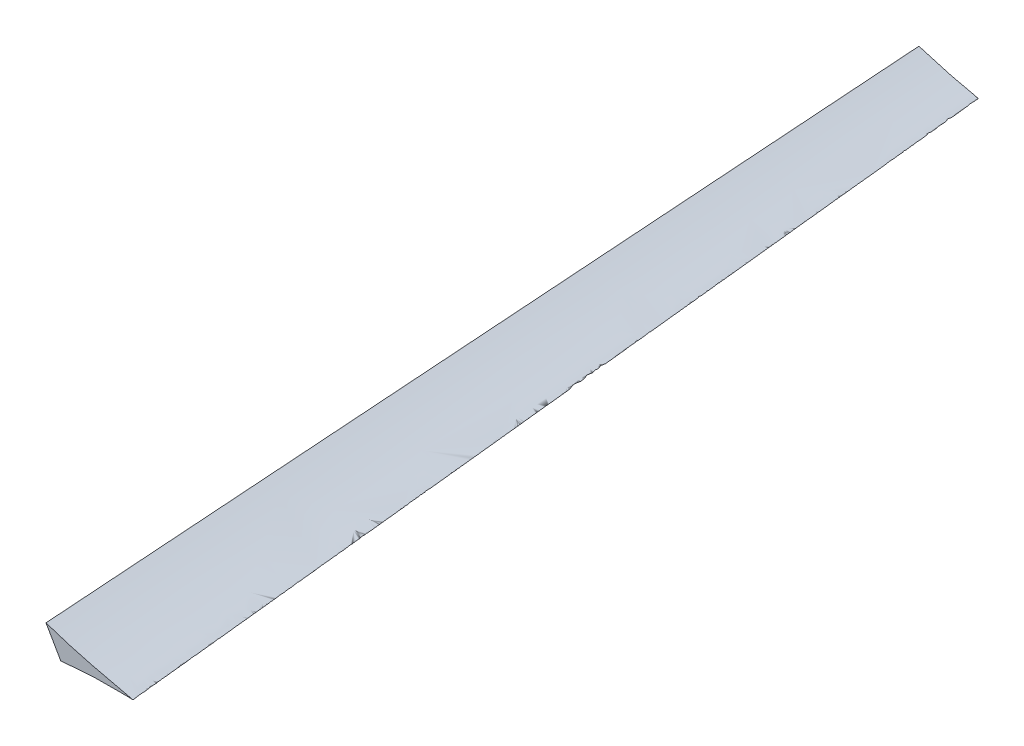
ISO-10303-21;
HEADER;
FILE_DESCRIPTION(('STEP AP214'),'2;1');
FILE_NAME('part.step','',(''),(''),'','','');
FILE_SCHEMA(('AUTOMOTIVE_DESIGN { 1 0 10303 214 1 1 1 1 }'));
ENDSEC;
DATA;
#1=APPLICATION_CONTEXT('core data for automotive mechanical design processes');
#2=APPLICATION_PROTOCOL_DEFINITION('international standard','automotive_design',2000,#1);
#3=PRODUCT_CONTEXT('',#1,'mechanical');
#4=PRODUCT('Part','Part','',(#3));
#5=PRODUCT_RELATED_PRODUCT_CATEGORY('part','',(#4));
#6=PRODUCT_DEFINITION_FORMATION('','',#4);
#7=PRODUCT_DEFINITION_CONTEXT('part definition',#1,'design');
#8=PRODUCT_DEFINITION('design','',#6,#7);
#9=PRODUCT_DEFINITION_SHAPE('','',#8);
#10=(LENGTH_UNIT() NAMED_UNIT(*) SI_UNIT(.MILLI.,.METRE.));
#11=(NAMED_UNIT(*) PLANE_ANGLE_UNIT() SI_UNIT($,.RADIAN.));
#12=(NAMED_UNIT(*) SI_UNIT($,.STERADIAN.) SOLID_ANGLE_UNIT());
#13=UNCERTAINTY_MEASURE_WITH_UNIT(LENGTH_MEASURE(1.E-05),#10,'distance_accuracy_value','');
#14=(GEOMETRIC_REPRESENTATION_CONTEXT(3) GLOBAL_UNCERTAINTY_ASSIGNED_CONTEXT((#13)) GLOBAL_UNIT_ASSIGNED_CONTEXT((#10,
#11,#12)) REPRESENTATION_CONTEXT('',''));
#15=CARTESIAN_POINT('',(0.,0.,0.));
#16=DIRECTION('',(0.,0.,1.));
#17=DIRECTION('',(1.,0.,0.));
#18=AXIS2_PLACEMENT_3D('',#15,#16,#17);
#19=CARTESIAN_POINT('',(-17.154805273375,-0.0944313994261866,-225.));
#20=DIRECTION('',(0.,0.,1.));
#21=DIRECTION('',(1.,0.,0.));
#22=AXIS2_PLACEMENT_3D('',#19,#20,#21);
#23=PLANE('',#22);
#24=CARTESIAN_POINT('',(-17.154805273375,4.28745633119217,-225.));
#25=CARTESIAN_POINT('',(-16.8274548071554,4.17854147808694,-225.));
#26=CARTESIAN_POINT('',(-16.4997626321679,4.07062789318908,-225.));
#27=CARTESIAN_POINT('',(-15.8434358874472,3.85764369440739,-225.));
#28=CARTESIAN_POINT('',(-15.5148012638481,3.75257324675626,-225.));
#29=CARTESIAN_POINT('',(-14.8564420552133,3.54615163630819,-225.));
#30=CARTESIAN_POINT('',(-14.5267177290354,3.44479965095852,-225.));
#31=CARTESIAN_POINT('',(-13.8659769446245,3.24642624477661,-225.));
#32=CARTESIAN_POINT('',(-13.5349605213983,3.14940470749282,-225.));
#33=CARTESIAN_POINT('',(-12.871648366401,2.95979194422061,-225.));
#34=CARTESIAN_POINT('',(-12.5393525844828,2.86720089384449,-225.));
#35=CARTESIAN_POINT('',(-11.8737026407721,2.68589221610204,-225.));
#36=CARTESIAN_POINT('',(-11.5403484606984,2.59717465603596,-225.));
#37=CARTESIAN_POINT('',(-10.8733992873974,2.42315086030521,-225.));
#38=CARTESIAN_POINT('',(-10.5398058295845,2.33783872492775,-225.));
#39=CARTESIAN_POINT('',(-9.87195586824538,2.16984964748907,-225.));
#40=CARTESIAN_POINT('',(-9.5376993617337,2.08717271732202,-225.));
#41=CARTESIAN_POINT('',(-8.86860293943321,1.92411829040433,-225.));
#42=CARTESIAN_POINT('',(-8.53376298634483,1.84374094685032,-225.));
#43=CARTESIAN_POINT('',(-8.03115106263001,1.72466007935425,-225.));
#44=CARTESIAN_POINT('',(-7.86355452081525,1.68521385040919,-225.));
#45=CARTESIAN_POINT('',(-7.528256526935,1.60676901085407,-225.));
#46=CARTESIAN_POINT('',(-7.36055507475706,1.5677704007246,-225.));
#47=CARTESIAN_POINT('',(-6.85730799932833,1.45156090581884,-225.));
#48=CARTESIAN_POINT('',(-6.52158219389306,1.37512746124546,-225.));
#49=CARTESIAN_POINT('',(-5.84951843928514,1.22501059156832,-225.));
#50=CARTESIAN_POINT('',(-5.51318049849585,1.15132712909568,-225.));
#51=CARTESIAN_POINT('',(-5.09242218145952,1.06133418195876,-225.));
#52=CARTESIAN_POINT('',(-5.00833595324779,1.04345846511528,-225.));
#53=CARTESIAN_POINT('',(-4.84011044559452,1.00795412760472,-225.));
#54=CARTESIAN_POINT('',(-4.75597116558276,0.990325509642616,-225.));
#55=CARTESIAN_POINT('',(-4.5877222370947,0.954907069724615,-225.));
#56=CARTESIAN_POINT('',(-4.50361259024129,0.937117240043163,-225.));
#57=CARTESIAN_POINT('',(-4.33550758699807,0.900956519205866,-225.));
#58=CARTESIAN_POINT('',(-4.25151224353177,0.88258556725356,-225.));
#59=CARTESIAN_POINT('',(-4.12569105641716,0.85426600896279,-225.));
#60=CARTESIAN_POINT('',(-4.08377945012904,0.844699003817763,-225.));
#61=CARTESIAN_POINT('',(-4.00002919467814,0.825257465364652,-225.));
#62=CARTESIAN_POINT('',(-3.95819054264244,0.815382944469138,-225.));
#63=CARTESIAN_POINT('',(-3.8954976790584,0.800299184135867,-225.));
#64=CARTESIAN_POINT('',(-3.87461072982664,0.795225889118224,-225.));
#65=CARTESIAN_POINT('',(-3.83286163533213,0.784983248998352,-225.));
#66=CARTESIAN_POINT('',(-3.81199948878006,0.779813909143917,-225.));
#67=CARTESIAN_POINT('',(-3.77029924049941,0.769367507842308,-225.));
#68=CARTESIAN_POINT('',(-3.74946114201505,0.764090433329137,-225.));
#69=CARTESIAN_POINT('',(-3.71822232217584,0.756100728274246,-225.));
#70=CARTESIAN_POINT('',(-3.70781182720145,0.753424985363909,-225.));
#71=CARTESIAN_POINT('',(-3.69220326178876,0.749377434636415,-225.));
#72=CARTESIAN_POINT('',(-3.68700127796001,0.748022509265523,-225.));
#73=CARTESIAN_POINT('',(-3.67659361044524,0.745328448450153,-225.));
#74=CARTESIAN_POINT('',(-3.6713879261694,0.743989316893704,-225.));
#75=CARTESIAN_POINT('',(-3.66521703496024,0.742341741978126,-225.));
#76=CARTESIAN_POINT('',(-3.66424292685211,0.742079879254616,-225.));
#77=CARTESIAN_POINT('',(-3.662275026068,0.74164294028181,-225.));
#78=CARTESIAN_POINT('',(-3.66128123515447,0.741467856298334,-225.));
#79=CARTESIAN_POINT('',(-3.65832373585228,0.74083740607208,-225.));
#80=CARTESIAN_POINT('',(-3.65638414082273,0.740276858035401,-225.));
#81=CARTESIAN_POINT('',(-3.65249412694922,0.73919834348764,-225.));
#82=CARTESIAN_POINT('',(-3.65054369877089,0.738680423007206,-225.));
#83=CARTESIAN_POINT('',(-3.64664508413168,0.737634000052685,-225.));
#84=CARTESIAN_POINT('',(-3.64469689750923,0.737105498399339,-225.));
#85=CARTESIAN_POINT('',(-3.6408004651271,0.736052349809624,-225.));
#86=CARTESIAN_POINT('',(-3.63885221966182,0.735527701506017,-225.));
#87=CARTESIAN_POINT('',(-3.6291257739167,0.732909551205167,-225.));
#88=CARTESIAN_POINT('',(-3.62134658390388,0.730819106000101,-225.));
#89=CARTESIAN_POINT('',(-3.60578374931704,0.726651030484295,-225.));
#90=CARTESIAN_POINT('',(-3.59800010428677,0.724573401922761,-225.));
#91=CARTESIAN_POINT('',(-3.57463265566895,0.71835459685448,-225.));
#92=CARTESIAN_POINT('',(-3.55904422767646,0.714230702692982,-225.));
#93=CARTESIAN_POINT('',(-3.51212162435898,0.701893434567638,-225.));
#94=CARTESIAN_POINT('',(-3.4807685792839,0.693751777687196,-225.));
#95=CARTESIAN_POINT('',(-3.41801270675659,0.677658599796763,-225.));
#96=CARTESIAN_POINT('',(-3.38660987780501,0.669707084633915,-225.));
#97=CARTESIAN_POINT('',(-3.32405533048103,0.654070246776564,-225.));
#98=CARTESIAN_POINT('',(-3.29290406501979,0.646383111429503,-225.));
#99=CARTESIAN_POINT('',(-3.23055752445763,0.631198114504568,-225.));
#100=CARTESIAN_POINT('',(-3.19936225239671,0.623700240469378,-225.));
#101=CARTESIAN_POINT('',(-3.16042484995815,0.614466820167867,-225.));
#102=CARTESIAN_POINT('',(-3.15270373313589,0.612642011848289,-225.));
#103=CARTESIAN_POINT('',(-3.13725750879781,0.60900373533487,-225.));
#104=CARTESIAN_POINT('',(-3.12953240085988,0.607190268863578,-225.));
#105=CARTESIAN_POINT('',(-3.11383593754039,0.603518076207635,-225.));
#106=CARTESIAN_POINT('',(-3.10586450712086,0.601659728491834,-225.));
#107=CARTESIAN_POINT('',(-3.08992065228005,0.597955753518258,-225.));
#108=CARTESIAN_POINT('',(-3.08194822975858,0.596110121136467,-225.));
#109=CARTESIAN_POINT('',(-3.06571389109438,0.592690870334895,-225.));
#110=CARTESIAN_POINT('',(-3.05745009387471,0.591126253510012,-225.));
#111=CARTESIAN_POINT('',(-3.0416211603906,0.58807777703294,-225.));
#112=CARTESIAN_POINT('',(-3.03405521991027,0.58659806098058,-225.));
#113=CARTESIAN_POINT('',(-3.02303042831954,0.584184046578115,-225.));
#114=CARTESIAN_POINT('',(-3.01954353537102,0.583382441190469,-225.));
#115=CARTESIAN_POINT('',(-3.0138728230176,0.581906147210064,-225.));
#116=CARTESIAN_POINT('',(-3.01167476480429,0.581290759728356,-225.));
#117=CARTESIAN_POINT('',(-3.00739326457115,0.579891400688159,-225.));
#118=CARTESIAN_POINT('',(-3.00530833122571,0.57911201630401,-225.));
#119=CARTESIAN_POINT('',(-3.00264169503864,0.57813583435996,-225.));
#120=CARTESIAN_POINT('',(-3.00206258646001,0.57792508020859,-225.));
#121=CARTESIAN_POINT('',(-3.00085965518158,0.577495254586398,-225.));
#122=CARTESIAN_POINT('',(-3.00023552631612,0.577276625533178,-225.));
#123=CARTESIAN_POINT('',(-2.99924573830641,0.576903545803618,-225.));
#124=CARTESIAN_POINT('',(-2.99887438763184,0.576757403600603,-225.));
#125=CARTESIAN_POINT('',(-2.99815948532802,0.576535510814193,-225.));
#126=CARTESIAN_POINT('',(-2.99782088588396,0.576452266799379,-225.));
#127=CARTESIAN_POINT('',(-2.99743622946959,0.576084050380272,-225.));
#128=CARTESIAN_POINT('',(-2.99732797917669,0.575916829912674,-225.));
#129=CARTESIAN_POINT('',(-2.99731846443573,0.57558232575548,-225.));
#130=CARTESIAN_POINT('',(-2.99741449170408,0.575415071925838,-225.));
#131=CARTESIAN_POINT('',(-2.99763058990272,0.575143900335442,-225.));
#132=CARTESIAN_POINT('',(-2.99774911299452,0.575037090540102,-225.));
#133=CARTESIAN_POINT('',(-2.9980124951954,0.574830932658372,-225.));
#134=CARTESIAN_POINT('',(-2.99815867932525,0.57473279201695,-225.));
#135=CARTESIAN_POINT('',(-2.99875677864996,0.574368407378923,-225.));
#136=CARTESIAN_POINT('',(-2.99923755098527,0.574156803281807,-225.));
#137=CARTESIAN_POINT('',(-3.00023699954129,0.573780242323621,-225.));
#138=CARTESIAN_POINT('',(-3.00075642275291,0.573617480637234,-225.));
#139=CARTESIAN_POINT('',(-3.00232321203038,0.573196546045231,-225.));
#140=CARTESIAN_POINT('',(-3.00338804266858,0.573001672155113,-225.));
#141=CARTESIAN_POINT('',(-3.00550123674396,0.572762959594012,-225.));
#142=CARTESIAN_POINT('',(-3.00654917083802,0.572714869931864,-225.));
#143=CARTESIAN_POINT('',(-3.00885539207372,0.572731437702774,-225.));
#144=CARTESIAN_POINT('',(-3.01011300946954,0.572821079123794,-225.));
#145=CARTESIAN_POINT('',(-3.01262981571037,0.572965280923609,-225.));
#146=CARTESIAN_POINT('',(-3.01388900504615,0.573019819708709,-225.));
#147=CARTESIAN_POINT('',(-3.01766602891057,0.573194045402714,-225.));
#148=CARTESIAN_POINT('',(-3.02018359638549,0.573324351312472,-225.));
#149=CARTESIAN_POINT('',(-3.0252670169311,0.573582594675518,-225.));
#150=CARTESIAN_POINT('',(-3.02783287106714,0.573710438932471,-225.));
#151=CARTESIAN_POINT('',(-3.03296420058216,0.573970041568413,-225.));
#152=CARTESIAN_POINT('',(-3.03552967597446,0.574101799595035,-225.));
#153=CARTESIAN_POINT('',(-3.04829608695718,0.574761861405771,-225.));
#154=CARTESIAN_POINT('',(-3.05849630678018,0.575303232543938,-225.));
#155=CARTESIAN_POINT('',(-3.07889586312066,0.576411652000047,-225.));
#156=CARTESIAN_POINT('',(-3.08909519957174,0.576978701556068,-225.));
#157=CARTESIAN_POINT('',(-3.10940965605663,0.578126025191004,-225.));
#158=CARTESIAN_POINT('',(-3.11952478439309,0.578706153662167,-225.));
#159=CARTESIAN_POINT('',(-3.13975414042385,0.579878678648238,-225.));
#160=CARTESIAN_POINT('',(-3.14986836813126,0.580471074938401,-225.));
#161=CARTESIAN_POINT('',(-3.20053747627945,0.583447979454152,-225.));
#162=CARTESIAN_POINT('',(-3.24109081071119,0.585860041344515,-225.));
#163=CARTESIAN_POINT('',(-3.32221098134748,0.590448171083753,-225.));
#164=CARTESIAN_POINT('',(-3.36277781757334,0.59262423855795,-225.));
#165=CARTESIAN_POINT('',(-3.4440554689801,0.596843599162664,-225.));
#166=CARTESIAN_POINT('',(-3.48476630818066,0.598886419588785,-225.));
#167=CARTESIAN_POINT('',(-3.56619317910365,0.602871699754555,-225.));
#168=CARTESIAN_POINT('',(-3.60690921086248,0.604814158746842,-225.));
#169=CARTESIAN_POINT('',(-3.81033979886331,0.614457325333683,-225.));
#170=CARTESIAN_POINT('',(-3.97306316264273,0.62197270713022,-225.));
#171=CARTESIAN_POINT('',(-4.29854396147257,0.636203601529941,-225.));
#172=CARTESIAN_POINT('',(-4.46130139606076,0.64291912435908,-225.));
#173=CARTESIAN_POINT('',(-4.70536927953456,0.651974525286422,-225.));
#174=CARTESIAN_POINT('',(-4.78666079473948,0.654821817040281,-225.));
#175=CARTESIAN_POINT('',(-4.94925645906658,0.660108593391877,-225.));
#176=CARTESIAN_POINT('',(-5.03056060806143,0.66254808186275,-225.));
#177=CARTESIAN_POINT('',(-5.19318262326742,0.666952368301322,-225.));
#178=CARTESIAN_POINT('',(-5.27450048961054,0.668917161406539,-225.));
#179=CARTESIAN_POINT('',(-5.43714754472391,0.672404521762351,-225.));
#180=CARTESIAN_POINT('',(-5.51847673371565,0.673927078601385,-225.));
#181=CARTESIAN_POINT('',(-5.68130552580931,0.676557400625308,-225.));
#182=CARTESIAN_POINT('',(-5.76280514241114,0.677664324707615,-225.));
#183=CARTESIAN_POINT('',(-5.92581166152977,0.679486135850095,-225.));
#184=CARTESIAN_POINT('',(-6.007318564203,0.680201008862676,-225.));
#185=CARTESIAN_POINT('',(-6.1295793474801,0.68099907207543,-225.));
#186=CARTESIAN_POINT('',(-6.17033238924951,0.681219384154362,-225.));
#187=CARTESIAN_POINT('',(-6.25183931533963,0.681571957810522,-225.));
#188=CARTESIAN_POINT('',(-6.29259319966468,0.681704218413211,-225.));
#189=CARTESIAN_POINT('',(-6.35372275025946,0.681838983344061,-225.));
#190=CARTESIAN_POINT('',(-6.37409835360503,0.68187330057252,-225.));
#191=CARTESIAN_POINT('',(-6.41484938024244,0.681921264154614,-225.));
#192=CARTESIAN_POINT('',(-6.435224803534,0.681934910718644,-225.));
#193=CARTESIAN_POINT('',(-6.47597489935808,0.681941462865698,-225.));
#194=CARTESIAN_POINT('',(-6.49634957189076,0.681934369208469,-225.));
#195=CARTESIAN_POINT('',(-6.53709959923172,0.681901678035036,-225.));
#196=CARTESIAN_POINT('',(-6.55747495404037,0.681876079909127,-225.));
#197=CARTESIAN_POINT('',(-6.5880399580483,0.681819010125697,-225.));
#198=CARTESIAN_POINT('',(-6.59822965872962,0.681796871561031,-225.));
#199=CARTESIAN_POINT('',(-6.61351397944833,0.681765537735678,-225.));
#200=CARTESIAN_POINT('',(-6.61860855188456,0.681755405757923,-225.));
#201=CARTESIAN_POINT('',(-6.62879723741196,0.681723618213431,-225.));
#202=CARTESIAN_POINT('',(-6.63389135051328,0.681701963239553,-225.));
#203=CARTESIAN_POINT('',(-6.64153334773554,0.681698177173978,-225.));
#204=CARTESIAN_POINT('',(-6.64408095467704,0.681701698842873,-225.));
#205=CARTESIAN_POINT('',(-6.64917502045002,0.681629655270558,-225.));
#206=CARTESIAN_POINT('',(-6.65172147929939,0.681554091307571,-225.));
#207=CARTESIAN_POINT('',(-6.65936058590298,0.681325229464016,-225.));
#208=CARTESIAN_POINT('',(-6.66445289268543,0.681169763675789,-225.));
#209=CARTESIAN_POINT('',(-6.67973075709003,0.680722286938717,-225.));
#210=CARTESIAN_POINT('',(-6.68991706663633,0.68044920319829,-225.));
#211=CARTESIAN_POINT('',(-6.7204754916516,0.679681496251018,-225.));
#212=CARTESIAN_POINT('',(-6.74084875818957,0.679238364585942,-225.));
#213=CARTESIAN_POINT('',(-6.78159734852616,0.678477675692379,-225.));
#214=CARTESIAN_POINT('',(-6.80197267228469,0.678160116365237,-225.));
#215=CARTESIAN_POINT('',(-6.863100190225,0.677359112104568,-225.));
#216=CARTESIAN_POINT('',(-6.9038542988336,0.677027332421732,-225.));
#217=CARTESIAN_POINT('',(-6.98536467590466,0.676602231083692,-225.));
#218=CARTESIAN_POINT('',(-7.02612094439432,0.676508917154139,-225.));
#219=CARTESIAN_POINT('',(-7.10763295398583,0.676390021395725,-225.));
#220=CARTESIAN_POINT('',(-7.1483886950882,0.676364438763891,-225.));
#221=CARTESIAN_POINT('',(-7.22989972384725,0.676235861869527,-225.));
#222=CARTESIAN_POINT('',(-7.27065501149969,0.676132868936263,-225.));
#223=CARTESIAN_POINT('',(-7.39291718130644,0.675358122296939,-225.));
#224=CARTESIAN_POINT('',(-7.47442070354078,0.674220603717292,-225.));
#225=CARTESIAN_POINT('',(-7.63743146994293,0.671745599550603,-225.));
#226=CARTESIAN_POINT('',(-7.71893871360183,0.670408092962672,-225.));
#227=CARTESIAN_POINT('',(-7.88194983126249,0.667420244718838,-225.));
#228=CARTESIAN_POINT('',(-7.9634537051495,0.665769896128397,-225.));
#229=CARTESIAN_POINT('',(-8.1264543979019,0.662191577407636,-225.));
#230=CARTESIAN_POINT('',(-8.20795121682742,0.660263609938375,-225.));
#231=CARTESIAN_POINT('',(-8.37093690628677,0.656125571673711,-225.));
#232=CARTESIAN_POINT('',(-8.45242577689337,0.653915503764505,-225.));
#233=CARTESIAN_POINT('',(-8.61539355393116,0.649219457371052,-225.));
#234=CARTESIAN_POINT('',(-8.69687246055729,0.646733485635593,-225.));
#235=CARTESIAN_POINT('',(-8.85982178747031,0.6414888953901,-225.));
#236=CARTESIAN_POINT('',(-8.94129220772573,0.638730275902931,-225.));
#237=CARTESIAN_POINT('',(-9.18568903997031,0.630051567309958,-225.));
#238=CARTESIAN_POINT('',(-9.34860115874579,0.623728624160865,-225.));
#239=CARTESIAN_POINT('',(-9.83753994583236,0.603184144690644,-225.));
#240=CARTESIAN_POINT('',(-10.1635022499046,0.587394746687516,-225.));
#241=CARTESIAN_POINT('',(-10.6522832532036,0.560766987560584,-225.));
#242=CARTESIAN_POINT('',(-10.8151842547329,0.55140038587829,-225.));
#243=CARTESIAN_POINT('',(-11.1409289733146,0.531718030689351,-225.));
#244=CARTESIAN_POINT('',(-11.3037726904435,0.521402278454817,-225.));
#245=CARTESIAN_POINT('',(-11.6293890266833,0.49985289226953,-225.));
#246=CARTESIAN_POINT('',(-11.792161649616,0.488619315983866,-225.));
#247=CARTESIAN_POINT('',(-12.0362730906305,0.471107462934116,-225.));
#248=CARTESIAN_POINT('',(-12.1176357531494,0.465159922936051,-225.));
#249=CARTESIAN_POINT('',(-12.2803445347924,0.453042428738094,-225.));
#250=CARTESIAN_POINT('',(-12.3616906539064,0.446872474404308,-225.));
#251=CARTESIAN_POINT('',(-12.6057119057054,0.428149587991018,-225.));
#252=CARTESIAN_POINT('',(-12.7683707065687,0.415383575852326,-225.));
#253=CARTESIAN_POINT('',(-13.093641239508,0.389267868347609,-225.));
#254=CARTESIAN_POINT('',(-13.2562529716434,0.375918173721491,-225.));
#255=CARTESIAN_POINT('',(-13.5628986148187,0.350202828322803,-225.));
#256=CARTESIAN_POINT('',(-13.7069376671781,0.337898425510276,-225.));
#257=CARTESIAN_POINT('',(-13.9949759581286,0.312846328879385,-225.));
#258=CARTESIAN_POINT('',(-14.1389751970552,0.300098638920288,-225.));
#259=CARTESIAN_POINT('',(-14.4268519560703,0.274173064835778,-225.));
#260=CARTESIAN_POINT('',(-14.5707294986848,0.260995430774331,-225.));
#261=CARTESIAN_POINT('',(-14.8584454977856,0.234208390923108,-225.));
#262=CARTESIAN_POINT('',(-15.0022839539643,0.220598981830722,-225.));
#263=CARTESIAN_POINT('',(-15.1461019106277,0.206776453082405,-225.));
#264=B_SPLINE_CURVE_WITH_KNOTS('',3,(#24,#25,#26,#27,#28,#29,#30,#31,#32,#33,#34,#35,#36,#37,
#38,#39,#40,#41,#42,#43,#44,#45,#46,#47,#48,#49,#50,#51,#52,#53,#54,#55,#56,#57,#58,#59,#60,#61,
#62,#63,#64,#65,#66,#67,#68,#69,#70,#71,#72,#73,#74,#75,#76,#77,#78,#79,#80,#81,#82,#83,#84,#85,
#86,#87,#88,#89,#90,#91,#92,#93,#94,#95,#96,#97,#98,#99,#100,#101,#102,#103,#104,#105,#106,#107,
#108,#109,#110,#111,#112,#113,#114,#115,#116,#117,#118,#119,#120,#121,#122,#123,#124,#125,#126,
#127,#128,#129,#130,#131,#132,#133,#134,#135,#136,#137,#138,#139,#140,#141,#142,#143,#144,#145,
#146,#147,#148,#149,#150,#151,#152,#153,#154,#155,#156,#157,#158,#159,#160,#161,#162,#163,#164,
#165,#166,#167,#168,#169,#170,#171,#172,#173,#174,#175,#176,#177,#178,#179,#180,#181,#182,#183,
#184,#185,#186,#187,#188,#189,#190,#191,#192,#193,#194,#195,#196,#197,#198,#199,#200,#201,#202,
#203,#204,#205,#206,#207,#208,#209,#210,#211,#212,#213,#214,#215,#216,#217,#218,#219,#220,#221,
#222,#223,#224,#225,#226,#227,#228,#229,#230,#231,#232,#233,#234,#235,#236,#237,#238,#239,#240,
#241,#242,#243,#244,#245,#246,#247,#248,#249,#250,#251,#252,#253,#254,#255,#256,#257,#258,#259,
#260,#261,#262,#263),.UNSPECIFIED.,.F.,.F.,(4,2,2,2,2,2,2,2,2,2,2,2,2,2,2,2,2,2,2,2,2,2,2,2,2,2,
2,2,2,2,2,2,2,2,2,2,2,2,2,2,2,2,2,2,2,2,2,2,2,2,2,2,2,2,2,2,2,2,2,2,2,2,2,2,2,2,2,2,2,2,2,2,2,2,
2,2,2,2,2,2,2,2,2,2,2,2,2,2,2,2,2,2,2,2,2,2,2,2,2,2,2,2,2,2,2,2,2,2,2,2,2,2,2,2,2,2,2,2,2,4),
(0.,1.03499246503239,2.0700453138796,3.10486780329572,4.13966244815922,5.17449807551261,
6.20935167555062,7.24232687741809,8.27530674102245,9.30835526143475,9.82488302051228,
10.3414113341065,11.3743524484741,12.4072795213257,12.6651751686894,12.9230736370187,
13.1809845303667,13.4389224959329,13.5678905450302,13.6968533951902,13.7613359361876,
13.8258149642243,13.8903018592494,13.9225490873384,13.9386747170038,13.9548042368305,
13.9578288213372,13.9608531362284,13.9669024788477,13.9729582703095,13.9790135938532,
13.9850666535823,14.0092319395127,14.0334004536068,14.0817744198838,14.1789525049284,
14.2761335745117,14.3723902001451,14.4686404734903,14.492442001269,14.5162470601664,
14.5408036102629,14.5653496058364,14.5905788466551,14.6137045342056,14.6244366231591,
14.6312789798615,14.6379506911324,14.639800632623,14.6417793631453,14.6429848180271,
14.643998817788,14.6445198341659,14.6450339860631,14.6455208310802,14.6460451553872,
14.6476141064415,14.6492455863774,14.6524794548138,14.6556187340389,14.6593980059792,
14.6631796005555,14.6707419577308,14.678449189822,14.6861557301032,14.7167994753478,
14.7474446996483,14.7778399430251,14.8082346300538,14.930109334377,15.0519842321928,
15.1742702959758,15.2965572702565,15.7852471162514,16.273930713824,16.5179539851169,
16.7619749386532,17.0059983916817,17.2500275892851,17.4945479929229,17.7390771574063,
17.8613379944676,17.9836001846675,18.0447270745516,18.1058533422498,18.1669773708238,
18.228103413474,18.2586726591369,18.2739563054653,18.2892391655232,18.2968814150359,
18.3045235410325,18.3198080061556,18.3503775131711,18.4115115608446,18.4726445867596,
18.5949095350722,18.7171784443919,18.8394459041741,18.9617112644641,19.2062409854388,
19.4507964027167,19.6953572415087,19.9399157362692,20.1844717291284,20.4290217413062,
20.6735726299521,21.1626740011592,22.1416774105263,22.6311855845014,23.1206931024169,
23.6101698891476,23.8549088707185,24.0996479996264,24.5891239300796,25.0785992400646,
25.5122894991139,25.9459759833907,26.3794145725004,26.8128564777434),.UNSPECIFIED.);
#265=CARTESIAN_POINT('',(-17.154805273375,4.28745633119217,-225.));
#266=VERTEX_POINT('',#265);
#267=CARTESIAN_POINT('',(-14.8168748482416,0.238042050299873,-225.));
#268=VERTEX_POINT('',#267);
#269=EDGE_CURVE('E98',#266,#268,#264,.T.);
#270=ORIENTED_EDGE('',*,*,#269,.T.);
#271=DIRECTION('',(-0.499999999999995,0.866025403784442,0.));
#272=VECTOR('',#271,1.);
#273=CARTESIAN_POINT('',(-11.0095809048169,-6.35638449906093,-225.));
#274=LINE('',#273,#272);
#275=EDGE_CURVE('E49',#268,#266,#274,.T.);
#276=ORIENTED_EDGE('',*,*,#275,.T.);
#277=EDGE_LOOP('',(#270,#276));
#278=FACE_BOUND('',#277,.T.);
#279=ADVANCED_FACE('F45',(#278),#23,.F.);
#280=CARTESIAN_POINT('',(20.7068296415713,-0.0944313994261866,0.));
#281=DIRECTION('',(0.,0.,-1.));
#282=DIRECTION('',(-1.,0.,0.));
#283=AXIS2_PLACEMENT_3D('',#280,#281,#282);
#284=PLANE('',#283);
#285=CARTESIAN_POINT('',(3.5095280736355,0.377639466814853,0.));
#286=CARTESIAN_POINT('',(4.06251706061063,0.432561923763316,0.));
#287=CARTESIAN_POINT('',(4.61574980043591,0.485097334857679,0.));
#288=CARTESIAN_POINT('',(5.72275127270442,0.584691292254532,0.));
#289=CARTESIAN_POINT('',(6.27652004431287,0.631749402197494,0.));
#290=CARTESIAN_POINT('',(7.38494774620416,0.719708258159524,0.));
#291=CARTESIAN_POINT('',(7.93960702941488,0.760604604512194,0.));
#292=CARTESIAN_POINT('',(8.77193275128417,0.816768324447024,0.));
#293=CARTESIAN_POINT('',(9.04942604982217,0.834625837108668,0.));
#294=CARTESIAN_POINT('',(9.6045225284597,0.868525906877897,0.));
#295=CARTESIAN_POINT('',(9.88212570795434,0.884568473840864,0.));
#296=CARTESIAN_POINT('',(10.4374683791253,0.914752298705406,0.));
#297=CARTESIAN_POINT('',(10.7152078830434,0.928893331426369,0.));
#298=CARTESIAN_POINT('',(11.2707857833907,0.955184143271269,0.));
#299=CARTESIAN_POINT('',(11.5486241812205,0.967333892969808,0.));
#300=CARTESIAN_POINT('',(11.9654542772616,0.983999683167016,0.));
#301=CARTESIAN_POINT('',(12.1044151701314,0.989295317729562,0.));
#302=CARTESIAN_POINT('',(12.3823559088187,0.999355844160864,0.));
#303=CARTESIAN_POINT('',(12.5213357545887,1.00412073733369,0.));
#304=CARTESIAN_POINT('',(12.7993080260617,1.01310888333285,0.));
#305=CARTESIAN_POINT('',(12.9383004511454,1.01733215532254,0.));
#306=CARTESIAN_POINT('',(13.2163018118575,1.0252260839515,0.));
#307=CARTESIAN_POINT('',(13.3553107475741,1.02889673749724,0.));
#308=CARTESIAN_POINT('',(13.5869699441414,1.03454537624204,0.));
#309=CARTESIAN_POINT('',(13.6796164160063,1.03667955059805,0.));
#310=CARTESIAN_POINT('',(13.8185896414103,1.03968910292394,0.));
#311=CARTESIAN_POINT('',(13.8649143345936,1.0406603297998,0.));
#312=CARTESIAN_POINT('',(13.9575652052176,1.04254233669713,0.));
#313=CARTESIAN_POINT('',(14.0038913826647,1.04345311640264,0.));
#314=CARTESIAN_POINT('',(14.0965465010795,1.04519816114563,0.));
#315=CARTESIAN_POINT('',(14.1428754420885,1.04603242395292,0.));
#316=CARTESIAN_POINT('',(14.2123689450482,1.04727031079262,0.));
#317=CARTESIAN_POINT('',(14.2355333658914,1.04768068684865,0.));
#318=CARTESIAN_POINT('',(14.2818635672139,1.04840984933716,0.));
#319=CARTESIAN_POINT('',(14.3050293476842,1.04872863631652,0.));
#320=CARTESIAN_POINT('',(14.3745289479423,1.04954387392419,0.));
#321=CARTESIAN_POINT('',(14.4208643902076,1.04989918858712,0.));
#322=CARTESIAN_POINT('',(14.5135366986213,1.05040659217328,0.));
#323=CARTESIAN_POINT('',(14.5598735647807,1.05055867801172,0.));
#324=CARTESIAN_POINT('',(14.6988874551112,1.0509333539523,0.));
#325=CARTESIAN_POINT('',(14.7915649604665,1.05107434830535,0.));
#326=CARTESIAN_POINT('',(14.9305774780082,1.05205015765025,0.));
#327=CARTESIAN_POINT('',(14.9769144172368,1.05250281475775,0.));
#328=CARTESIAN_POINT('',(15.0464155369839,1.05349169615514,0.));
#329=CARTESIAN_POINT('',(15.069581908106,1.05387297364309,0.));
#330=CARTESIAN_POINT('',(15.1159117625051,1.05475919718107,0.));
#331=CARTESIAN_POINT('',(15.1390752458383,1.05526414023755,0.));
#332=CARTESIAN_POINT('',(15.1854004444847,1.05641798027845,0.));
#333=CARTESIAN_POINT('',(15.2085621595288,1.05706688821989,0.));
#334=CARTESIAN_POINT('',(15.2433010093541,1.05816496405663,0.));
#335=CARTESIAN_POINT('',(15.2548801090451,1.05855177900676,0.));
#336=CARTESIAN_POINT('',(15.278037064831,1.05936798872182,0.));
#337=CARTESIAN_POINT('',(15.2896149208794,1.05979738473648,0.));
#338=CARTESIAN_POINT('',(15.31277067405,1.06070834682703,0.));
#339=CARTESIAN_POINT('',(15.3243485709226,1.06118992064542,0.));
#340=CARTESIAN_POINT('',(15.3417129033197,1.06193414663717,0.));
#341=CARTESIAN_POINT('',(15.3475003494959,1.06218585502123,0.));
#342=CARTESIAN_POINT('',(15.3590743639171,1.06272958582353,0.));
#343=CARTESIAN_POINT('',(15.3648609321334,1.06302160100569,0.));
#344=CARTESIAN_POINT('',(15.3735467940499,1.06318086177009,0.));
#345=CARTESIAN_POINT('',(15.3764429145277,1.06318749606688,0.));
#346=CARTESIAN_POINT('',(15.3822350203364,1.06321962041446,0.));
#347=CARTESIAN_POINT('',(15.3851310056016,1.06324511290262,0.));
#348=CARTESIAN_POINT('',(15.3938197654297,1.06331594965262,0.));
#349=CARTESIAN_POINT('',(15.3996126834223,1.06335564609651,0.));
#350=CARTESIAN_POINT('',(15.4111991833595,1.06343772231067,0.));
#351=CARTESIAN_POINT('',(15.4169927652922,1.06348010243063,0.));
#352=CARTESIAN_POINT('',(15.4285796747019,1.06356280632546,0.));
#353=CARTESIAN_POINT('',(15.4343730021774,1.06360313020254,0.));
#354=CARTESIAN_POINT('',(15.4517502953893,1.06372273376697,0.));
#355=CARTESIAN_POINT('',(15.4633342651526,1.06380066476082,0.));
#356=CARTESIAN_POINT('',(15.4865016023963,1.06395197369231,0.));
#357=CARTESIAN_POINT('',(15.4980849698749,1.06402535187956,0.));
#358=CARTESIAN_POINT('',(15.5328365321978,1.06423893410661,0.));
#359=CARTESIAN_POINT('',(15.556004766698,1.06437257601031,0.));
#360=CARTESIAN_POINT('',(15.6023433425283,1.06462181672343,0.));
#361=CARTESIAN_POINT('',(15.6255136838668,1.06473741396733,0.));
#362=CARTESIAN_POINT('',(15.6718541960595,1.06495021501072,0.));
#363=CARTESIAN_POINT('',(15.6950243669127,1.06504741901201,0.));
#364=CARTESIAN_POINT('',(15.7645253314675,1.06531081699754,0.));
#365=CARTESIAN_POINT('',(15.8108562357698,1.06544884922791,0.));
#366=CARTESIAN_POINT('',(15.9035166974889,1.0656467582381,0.));
#367=CARTESIAN_POINT('',(15.9498462549003,1.06570663756953,0.));
#368=CARTESIAN_POINT('',(16.0425080728666,1.0657451939926,0.));
#369=CARTESIAN_POINT('',(16.0888403334237,1.06572386641311,0.));
#370=CARTESIAN_POINT('',(16.181505224007,1.06559694313902,0.));
#371=CARTESIAN_POINT('',(16.2278378540319,1.06549134655209,0.));
#372=CARTESIAN_POINT('',(16.3668319494048,1.06504357673791,0.));
#373=CARTESIAN_POINT('',(16.4594930372399,1.06457042532996,0.));
#374=CARTESIAN_POINT('',(16.6448107026257,1.06325039702688,0.));
#375=CARTESIAN_POINT('',(16.7374672802298,1.06240352762264,0.));
#376=CARTESIAN_POINT('',(16.9227555068585,1.06031176872876,0.));
#377=CARTESIAN_POINT('',(17.0153871568672,1.05906696723798,0.));
#378=CARTESIAN_POINT('',(17.2006453371907,1.05615494720936,0.));
#379=CARTESIAN_POINT('',(17.2932718673993,1.05448772187572,0.));
#380=CARTESIAN_POINT('',(17.4785164003194,1.05070576563485,0.));
#381=CARTESIAN_POINT('',(17.5711344029778,1.04859103210099,0.));
#382=CARTESIAN_POINT('',(17.7563578199164,1.04389184449549,0.));
#383=CARTESIAN_POINT('',(17.8489632342756,1.0413073935199,0.));
#384=CARTESIAN_POINT('',(18.1267670098398,1.03295721963977,0.));
#385=CARTESIAN_POINT('',(18.3119473554184,1.02659479484949,0.));
#386=CARTESIAN_POINT('',(18.6823224360662,1.01283248598253,0.));
#387=CARTESIAN_POINT('',(18.8675171594379,1.00543229829942,0.));
#388=CARTESIAN_POINT('',(19.1452939474728,0.993982640678827,0.));
#389=CARTESIAN_POINT('',(19.2378833527602,0.990107872256055,0.));
#390=CARTESIAN_POINT('',(19.4230598621115,0.982299348129112,0.));
#391=CARTESIAN_POINT('',(19.515646966171,0.978365592317162,0.));
#392=CARTESIAN_POINT('',(19.7008222972873,0.970559287911666,0.));
#393=CARTESIAN_POINT('',(19.7934105243053,0.966686738381638,0.));
#394=CARTESIAN_POINT('',(19.9785784979727,0.958745482550033,0.));
#395=CARTESIAN_POINT('',(20.071158244652,0.954676776969236,0.));
#396=CARTESIAN_POINT('',(20.1984372977531,0.94863732577381,0.));
#397=CARTESIAN_POINT('',(20.2331493387293,0.946944619795975,0.));
#398=CARTESIAN_POINT('',(20.302567599684,0.943450018568163,0.));
#399=CARTESIAN_POINT('',(20.3372738196001,0.941648122215342,0.));
#400=CARTESIAN_POINT('',(20.4413197701424,0.936038406016585,0.));
#401=CARTESIAN_POINT('',(20.5106523910608,0.932023545893763,0.));
#402=CARTESIAN_POINT('',(20.5972612594777,0.926605046369148,0.));
#403=CARTESIAN_POINT('',(20.6145700505863,0.925502015934667,0.));
#404=CARTESIAN_POINT('',(20.6492402940593,0.923212372774582,0.));
#405=CARTESIAN_POINT('',(20.6666017715477,0.922025561892686,0.));
#406=CARTESIAN_POINT('',(20.6861049798778,0.92073693336464,0.));
#407=CARTESIAN_POINT('',(20.6882738776001,0.920594250235723,0.));
#408=CARTESIAN_POINT('',(20.6926157347894,0.920275643658891,0.));
#409=CARTESIAN_POINT('',(20.6947886423489,0.920099856986949,0.));
#410=CARTESIAN_POINT('',(20.6980455896228,0.92032914126139,0.));
#411=CARTESIAN_POINT('',(20.6991389345285,0.920490812926149,0.));
#412=CARTESIAN_POINT('',(20.7012914890824,0.92096286075835,0.));
#413=CARTESIAN_POINT('',(20.7023506970827,0.921273244093272,0.));
#414=CARTESIAN_POINT('',(20.7041883623895,0.922036393225863,0.));
#415=CARTESIAN_POINT('',(20.7049809597738,0.922448946133794,0.));
#416=CARTESIAN_POINT('',(20.7060265838479,0.923275215768488,0.));
#417=CARTESIAN_POINT('',(20.706351852957,0.923586209047716,0.));
#418=CARTESIAN_POINT('',(20.7067494882377,0.924292077222867,0.));
#419=CARTESIAN_POINT('',(20.7068611242804,0.924654673808947,0.));
#420=CARTESIAN_POINT('',(20.7067764013265,0.925355237140672,0.));
#421=CARTESIAN_POINT('',(20.7065672709726,0.925691592090454,0.));
#422=CARTESIAN_POINT('',(20.7060508771535,0.926229750989372,0.));
#423=CARTESIAN_POINT('',(20.7057428306025,0.926430440156827,0.));
#424=CARTESIAN_POINT('',(20.7044471843637,0.927127529551332,0.));
#425=CARTESIAN_POINT('',(20.7033518880389,0.927395053049913,0.));
#426=CARTESIAN_POINT('',(20.6997517916255,0.928230567168474,0.));
#427=CARTESIAN_POINT('',(20.6972665495914,0.928736813509501,0.));
#428=CARTESIAN_POINT('',(20.6923026921954,0.929786105304604,0.));
#429=CARTESIAN_POINT('',(20.6898241678215,0.930328844998089,0.));
#430=CARTESIAN_POINT('',(20.6774136611745,0.933039349900165,0.));
#431=CARTESIAN_POINT('',(20.6674937759208,0.935183073545134,0.));
#432=CARTESIAN_POINT('',(20.6476210507855,0.93951372321841,0.));
#433=CARTESIAN_POINT('',(20.6376682059504,0.941700764486217,0.));
#434=CARTESIAN_POINT('',(20.5879525192711,0.95266923454441,0.));
#435=CARTESIAN_POINT('',(20.5482248889585,0.961574551670178,0.));
#436=CARTESIAN_POINT('',(20.4688840473755,0.979678524197948,0.));
#437=CARTESIAN_POINT('',(20.4292707552732,0.988876801418871,0.));
#438=CARTESIAN_POINT('',(20.310492012459,1.01692298147972,0.));
#439=CARTESIAN_POINT('',(20.2314316528626,1.03621254091297,0.));
#440=CARTESIAN_POINT('',(20.0735817493823,1.0759879137981,0.));
#441=CARTESIAN_POINT('',(19.9947923099882,1.09647414364563,0.));
#442=CARTESIAN_POINT('',(19.8965133096149,1.12282929194613,0.));
#443=CARTESIAN_POINT('',(19.8768720311505,1.12813655914622,0.));
#444=CARTESIAN_POINT('',(19.8376108048813,1.13882558968095,0.));
#445=CARTESIAN_POINT('',(19.8179908560055,1.14420734906989,0.));
#446=CARTESIAN_POINT('',(19.7885769217325,1.15233750663745,0.));
#447=CARTESIAN_POINT('',(19.7787749489438,1.15505714357348,0.));
#448=CARTESIAN_POINT('',(19.7591752274181,1.16051350212759,0.));
#449=CARTESIAN_POINT('',(19.749377478876,1.16325022445924,0.));
#450=CARTESIAN_POINT('',(19.7371349902533,1.16668748205277,0.));
#451=CARTESIAN_POINT('',(19.734686665492,1.16737576874139,0.));
#452=CARTESIAN_POINT('',(19.7297893166679,1.16874939762329,0.));
#453=CARTESIAN_POINT('',(19.7273402927165,1.16943474014274,0.));
#454=CARTESIAN_POINT('',(19.7236701683949,1.17047562983148,0.));
#455=CARTESIAN_POINT('',(19.7224470341352,1.17082483457682,0.));
#456=CARTESIAN_POINT('',(19.7206070320722,1.17133269838367,0.));
#457=CARTESIAN_POINT('',(19.7199927537014,1.17149934476505,0.));
#458=CARTESIAN_POINT('',(19.7187539740144,1.17178997348247,0.));
#459=CARTESIAN_POINT('',(19.7181294689289,1.1719139396996,0.));
#460=CARTESIAN_POINT('',(19.7162494593451,1.17226531166219,0.));
#461=CARTESIAN_POINT('',(19.7149898725209,1.1724716271183,0.));
#462=CARTESIAN_POINT('',(19.7124991442128,1.17301442731509,0.));
#463=CARTESIAN_POINT('',(19.7112679951991,1.17335087717055,0.));
#464=CARTESIAN_POINT('',(19.7088063540715,1.17401752651461,0.));
#465=CARTESIAN_POINT('',(19.7075758619558,1.17434772922684,0.));
#466=CARTESIAN_POINT('',(19.70511452213,1.17500930326309,0.));
#467=CARTESIAN_POINT('',(19.7038836743967,1.17534067479648,0.));
#468=CARTESIAN_POINT('',(19.6977308054513,1.17699580751263,0.));
#469=CARTESIAN_POINT('',(19.6928080813781,1.17831569111426,0.));
#470=CARTESIAN_POINT('',(19.6780577895245,1.18226211543863,0.));
#471=CARTESIAN_POINT('',(19.6682279401685,1.18488087006474,0.));
#472=CARTESIAN_POINT('',(19.6485624049165,1.19009573301525,0.));
#473=CARTESIAN_POINT('',(19.6387267190379,1.19269184140706,0.));
#474=CARTESIAN_POINT('',(19.6092109543635,1.20044782222324,0.));
#475=CARTESIAN_POINT('',(19.5895223322742,1.20557530649103,0.));
#476=CARTESIAN_POINT('',(19.4910198961122,1.23100696923651,0.));
#477=CARTESIAN_POINT('',(19.4120450388021,1.25068939837893,0.));
#478=CARTESIAN_POINT('',(19.2538298343252,1.28897961222622,0.));
#479=CARTESIAN_POINT('',(19.1745894648945,1.307587304298,0.));
#480=CARTESIAN_POINT('',(18.9366057425002,1.36216510949143,0.));
#481=CARTESIAN_POINT('',(18.7775798054922,1.39689497160163,0.));
#482=CARTESIAN_POINT('',(18.4592591709258,1.46510806918684,0.));
#483=CARTESIAN_POINT('',(18.2999644587487,1.49859123440864,0.));
#484=CARTESIAN_POINT('',(17.9815162229508,1.56622507958881,0.));
#485=CARTESIAN_POINT('',(17.8223626985174,1.60037575567817,0.));
#486=CARTESIAN_POINT('',(17.5041768556684,1.66921696989626,0.));
#487=CARTESIAN_POINT('',(17.3451445345616,1.70390749564765,0.));
#488=CARTESIAN_POINT('',(16.76219608118,1.83207249184039,0.));
#489=CARTESIAN_POINT('',(16.3386301194427,1.92714332569441,0.));
#490=CARTESIAN_POINT('',(15.4921615082639,2.12022775745127,0.));
#491=CARTESIAN_POINT('',(15.0692588751396,2.21824142658625,0.));
#492=CARTESIAN_POINT('',(14.435291151455,2.36692227460831,0.));
#493=CARTESIAN_POINT('',(14.2240309190237,2.41675976837582,0.));
#494=CARTESIAN_POINT('',(13.8016164780905,2.51688214200235,0.));
#495=CARTESIAN_POINT('',(13.5904622696085,2.56716702194542,0.));
#496=CARTESIAN_POINT('',(12.9571476986978,2.71876271845651,0.));
#497=CARTESIAN_POINT('',(12.5351627202763,2.82080818378043,0.));
#498=CARTESIAN_POINT('',(11.6918083853277,3.02738208050617,0.));
#499=CARTESIAN_POINT('',(11.2704390170669,3.13191046391052,0.));
#500=CARTESIAN_POINT('',(10.4284545832938,3.34395569944775,0.));
#501=CARTESIAN_POINT('',(10.0078395142378,3.45147253750228,0.));
#502=CARTESIAN_POINT('',(9.04904496698679,3.70081164575962,0.));
#503=CARTESIAN_POINT('',(8.51115649705486,3.84375893975407,0.));
#504=CARTESIAN_POINT('',(7.70571375879845,4.06328696894529,0.));
#505=CARTESIAN_POINT('',(7.43746229125587,4.13731479428839,0.));
#506=CARTESIAN_POINT('',(6.90147067920384,4.28719964116527,0.));
#507=CARTESIAN_POINT('',(6.63373053386906,4.36305665974381,0.));
#508=CARTESIAN_POINT('',(6.09881446245412,4.5167508111439,0.));
#509=CARTESIAN_POINT('',(5.83163854487198,4.59458797356192,0.));
#510=CARTESIAN_POINT('',(5.29788578575699,4.75228886586507,0.));
#511=CARTESIAN_POINT('',(5.03130894479771,4.83215259768961,0.));
#512=CARTESIAN_POINT('',(4.23247440991187,5.07455016507711,0.));
#513=CARTESIAN_POINT('',(3.70107011835746,5.23990264114456,0.));
#514=CARTESIAN_POINT('',(2.6403350078302,5.57716511803451,0.));
#515=CARTESIAN_POINT('',(2.1110042591615,5.74907533911343,0.));
#516=CARTESIAN_POINT('',(1.05418338916218,6.0984751699386,0.));
#517=CARTESIAN_POINT('',(0.526693274556022,6.27596480004461,0.));
#518=CARTESIAN_POINT('',(0.,6.45575704802336,0.));
#519=B_SPLINE_CURVE_WITH_KNOTS('',3,(#285,#286,#287,#288,#289,#290,#291,#292,#293,#294,#295,
#296,#297,#298,#299,#300,#301,#302,#303,#304,#305,#306,#307,#308,#309,#310,#311,#312,#313,#314,
#315,#316,#317,#318,#319,#320,#321,#322,#323,#324,#325,#326,#327,#328,#329,#330,#331,#332,#333,
#334,#335,#336,#337,#338,#339,#340,#341,#342,#343,#344,#345,#346,#347,#348,#349,#350,#351,#352,
#353,#354,#355,#356,#357,#358,#359,#360,#361,#362,#363,#364,#365,#366,#367,#368,#369,#370,#371,
#372,#373,#374,#375,#376,#377,#378,#379,#380,#381,#382,#383,#384,#385,#386,#387,#388,#389,#390,
#391,#392,#393,#394,#395,#396,#397,#398,#399,#400,#401,#402,#403,#404,#405,#406,#407,#408,#409,
#410,#411,#412,#413,#414,#415,#416,#417,#418,#419,#420,#421,#422,#423,#424,#425,#426,#427,#428,
#429,#430,#431,#432,#433,#434,#435,#436,#437,#438,#439,#440,#441,#442,#443,#444,#445,#446,#447,
#448,#449,#450,#451,#452,#453,#454,#455,#456,#457,#458,#459,#460,#461,#462,#463,#464,#465,#466,
#467,#468,#469,#470,#471,#472,#473,#474,#475,#476,#477,#478,#479,#480,#481,#482,#483,#484,#485,
#486,#487,#488,#489,#490,#491,#492,#493,#494,#495,#496,#497,#498,#499,#500,#501,#502,#503,#504,
#505,#506,#507,#508,#509,#510,#511,#512,#513,#514,#515,#516,#517,#518),.UNSPECIFIED.,.F.,.F.,(4,
2,2,2,2,2,2,2,2,2,2,2,2,2,2,2,2,2,2,2,2,2,2,2,2,2,2,2,2,2,2,2,2,2,2,2,2,2,2,2,2,2,2,2,2,2,2,2,2,
2,2,2,2,2,2,2,2,2,2,2,2,2,2,2,2,2,2,2,2,2,2,2,2,2,2,2,2,2,2,2,2,2,2,2,2,2,2,2,2,2,2,2,2,2,2,2,2,
2,2,2,2,2,2,2,2,2,2,2,2,2,2,2,2,2,2,2,4),(0.,1.66713346322908,3.33439965101527,5.00285072712941,
5.83704777471518,6.67124029228914,7.50553150851557,8.33983505203953,8.757019506042,
9.17420293496631,9.5913715992456,10.0085425987289,10.2865553984507,10.4255599886806,
10.5645653053957,10.7035746723349,10.7730787834124,10.8425824794691,10.9815917810002,
11.1206031925085,11.3986344476669,11.5376504160521,11.6071586766415,11.6766652548328,
11.746177124914,11.7809336816408,11.8156912587618,11.8504540005408,11.8678338948565,
11.8852106730923,11.8938980528715,11.9025865556598,11.9199655432688,11.9373468000785,
11.9547271919531,11.9894798957826,12.0242306925375,12.0937365468414,12.1632484280096,
12.2327595464399,12.371752807092,12.5107415296325,12.6497382470801,12.7887364363684,
13.0667225634408,13.3447031187489,13.6226222437977,13.9005458401873,14.1784710678765,
14.4563944637371,15.0122579029775,15.56828430542,15.8462956575546,16.1243075177224,
16.4023151200625,16.6803217009352,16.7845810078575,16.8888413679952,17.0971650623794,
17.1492053397931,17.2013731162979,17.207901898837,17.2144042754312,17.2177047887682,
17.2210054611966,17.2236544319019,17.2249853143198,17.2260308644234,17.2271191366912,
17.22821624612,17.2315450249387,17.2392032107236,17.2468037374983,17.2772730182801,
17.307838711837,17.4299885148723,17.5519865621932,17.7961176764254,18.0403342509393,
18.1013712605078,18.1624050493419,18.1929218993337,18.2234400325002,18.2310698229914,
18.2386987452115,18.2425152571748,18.2444238900396,18.2463332429446,18.2501593715072,
18.2539844751071,18.2578075478808,18.2616313442429,18.2769215463051,18.3074392973754,
18.3379569575905,18.3989927865217,18.6431536168512,18.8873354604355,19.3756373892632,
19.8639667931119,20.3522933673547,20.8406087620049,22.1429060101457,23.4452348062054,
24.096411723154,24.7475887624398,26.0500270522488,27.3524401849773,28.654847183182,
30.3244804744546,31.1593109483046,31.9941400734923,32.8289816838914,33.6638240932567,
35.3333759716626,37.0029839751358,38.6725980718648),.UNSPECIFIED.);
#520=CARTESIAN_POINT('',(3.50940809250068,0.377283620019735,0.));
#521=VERTEX_POINT('',#520);
#522=CARTESIAN_POINT('',(0.,6.45575704802336,0.));
#523=VERTEX_POINT('',#522);
#524=EDGE_CURVE('E75',#521,#523,#519,.T.);
#525=ORIENTED_EDGE('',*,*,#524,.T.);
#526=DIRECTION('',(0.499999999999995,-0.866025403784442,0.));
#527=VECTOR('',#526,1.);
#528=CARTESIAN_POINT('',(0.,6.45575704802336,0.));
#529=LINE('',#528,#527);
#530=EDGE_CURVE('E72',#523,#521,#529,.T.);
#531=ORIENTED_EDGE('',*,*,#530,.T.);
#532=EDGE_LOOP('',(#525,#531));
#533=FACE_BOUND('',#532,.T.);
#534=ADVANCED_FACE('F74',(#533),#284,.F.);
#535=CARTESIAN_POINT('',(0.,0.,0.));
#536=CARTESIAN_POINT('',(-34.3096105467501,0.,-450.));
#537=CARTESIAN_POINT('',(2.35539681927631,0.270746704499762,0.));
#538=CARTESIAN_POINT('',(-33.4425384690632,0.0825516021248429,-450.));
#539=CARTESIAN_POINT('',(4.71220957718891,0.51130590002586,0.));
#540=CARTESIAN_POINT('',(-32.5783514719179,0.144259224484087,-449.999999999999));
#541=CARTESIAN_POINT('',(9.45907165768016,0.88016641357371,0.));
#542=CARTESIAN_POINT('',(-30.8336554247353,0.267288499677668,-450.000000000002));
#543=CARTESIAN_POINT('',(11.8491959375354,1.00717041714158,0.));
#544=CARTESIAN_POINT('',(-29.9543041083434,0.300801429090974,-450.000000000002));
#545=CARTESIAN_POINT('',(14.6156340813502,1.05410829696468,0.));
#546=CARTESIAN_POINT('',(-28.9393902060664,0.302228720574049,-450.000000000001));
#547=CARTESIAN_POINT('',(14.9964664172829,1.04567548052727,0.));
#548=CARTESIAN_POINT('',(-28.8013737954337,0.301637710811088,-450.000000000001));
#549=CARTESIAN_POINT('',(15.3674400910152,1.06311316920738,0.));
#550=CARTESIAN_POINT('',(-28.6633808068798,0.300235442473779,-450.000000000001));
#551=CARTESIAN_POINT('',(16.1331562944656,1.06894481953375,0.));
#552=CARTESIAN_POINT('',(-28.3824575907585,0.297357656452759,-450.000000000001));
#553=CARTESIAN_POINT('',(17.0889467251276,1.06479378408477,0.));
#554=CARTESIAN_POINT('',(-28.0319902374884,0.289597939077022,-450.000000000001));
#555=CARTESIAN_POINT('',(18.5316690137933,1.02071892186908,0.));
#556=CARTESIAN_POINT('',(-27.5029329264989,0.26966078287003,-450.000000000001));
#557=CARTESIAN_POINT('',(19.4254964547902,0.981889586186792,0.));
#558=CARTESIAN_POINT('',(-27.1753192310959,0.253633537087867,-450.000000000001));
#559=CARTESIAN_POINT('',(20.2445560697013,0.947812273497972,0.));
#560=CARTESIAN_POINT('',(-26.8751358572883,0.233967708651836,-450.));
#561=CARTESIAN_POINT('',(20.5744292527559,0.928412404970619,0.));
#562=CARTESIAN_POINT('',(-26.7537875212296,0.224941630263218,-449.999999999999));
#563=CARTESIAN_POINT('',(20.7035682026086,0.919532793746784,0.));
#564=CARTESIAN_POINT('',(-26.7062561474906,0.225283262618005,-450.));
#565=CARTESIAN_POINT('',(20.7124574741318,0.925450725523733,0.));
#566=CARTESIAN_POINT('',(-26.7024926874873,0.225336746905984,-450.));
#567=CARTESIAN_POINT('',(20.7003302692325,0.92806432640711,0.));
#568=CARTESIAN_POINT('',(-26.6979360960571,0.225436376915,-450.));
#569=CARTESIAN_POINT('',(20.690452819174,0.930195115223583,0.));
#570=CARTESIAN_POINT('',(-26.694224881153,0.225523513587657,-450.));
#571=CARTESIAN_POINT('',(20.680575660366,0.932335407085449,0.));
#572=CARTESIAN_POINT('',(-26.6905140997578,0.225639143229653,-450.));
#573=CARTESIAN_POINT('',(20.6344866402577,0.942357603928959,0.));
#574=CARTESIAN_POINT('',(-26.6804125314329,0.22844805729962,-450.));
#575=CARTESIAN_POINT('',(20.5961682380817,0.950834188772515,0.));
#576=CARTESIAN_POINT('',(-26.7159225996328,0.231171103141435,-450.));
#577=CARTESIAN_POINT('',(20.277353557562,1.0225647693047,0.));
#578=CARTESIAN_POINT('',(-26.8324203580235,0.260211799073063,-450.));
#579=CARTESIAN_POINT('',(19.9974896757156,1.0932924886654,0.));
#580=CARTESIAN_POINT('',(-26.9349677682536,0.285577884969668,-450.));
#581=CARTESIAN_POINT('',(19.7178942184361,1.17210093127928,0.));
#582=CARTESIAN_POINT('',(-27.0387173076831,0.310608746496736,-450.));
#583=CARTESIAN_POINT('',(19.7148259282114,1.17239313200051,0.));
#584=CARTESIAN_POINT('',(-27.0397815863146,0.310865449735521,-450.));
#585=CARTESIAN_POINT('',(19.2057025350145,1.30967172096032,0.));
#586=CARTESIAN_POINT('',(-27.2280355971123,0.356260217094766,-450.));
#587=CARTESIAN_POINT('',(18.6431954720222,1.4254694119392,0.));
#588=CARTESIAN_POINT('',(-27.4332255968619,0.403450904977137,-450.));
#589=CARTESIAN_POINT('',(18.0816531552063,1.54497017443397,0.));
#590=CARTESIAN_POINT('',(-27.6396241074089,0.445327250905855,-450.));
#591=CARTESIAN_POINT('',(16.6499373096479,1.85048608574585,0.));
#592=CARTESIAN_POINT('',(-28.166212928102,0.550892738367685,-450.));
#593=CARTESIAN_POINT('',(14.0179647397633,2.45658337294298,0.));
#594=CARTESIAN_POINT('',(-29.1357013740878,0.757785032409924,-450.));
#595=CARTESIAN_POINT('',(9.94793862090724,3.44966346728158,0.));
#596=CARTESIAN_POINT('',(-30.6333825518239,1.10573319492361,-450.));
#597=CARTESIAN_POINT('',(6.60963452365498,4.35268468821348,0.));
#598=CARTESIAN_POINT('',(-31.8666677002811,1.40948795088865,-449.999999999999));
#599=CARTESIAN_POINT('',(3.23072911782983,5.37608814437516,0.));
#600=CARTESIAN_POINT('',(-33.1159764986557,1.7514010655046,-449.999999999999));
#601=CARTESIAN_POINT('',(1.28851784077704,6.01590461427881,0.));
#602=CARTESIAN_POINT('',(-33.8317980318795,1.97125584450726,-450.));
#603=CARTESIAN_POINT('',(0.,6.45575704802336,0.));
#604=CARTESIAN_POINT('',(-34.3096105467501,2.11915561436099,-450.));
#605=B_SPLINE_SURFACE_WITH_KNOTS('',3,1,((#535,#536),(#537,#538),(#539,#540),(#541,#542),(#543,
#544),(#545,#546),(#547,#548),(#549,#550),(#551,#552),(#553,#554),(#555,#556),(#557,#558),(#559,
#560),(#561,#562),(#563,#564),(#565,#566),(#567,#568),(#569,#570),(#571,#572),(#573,#574),(#575,
#576),(#577,#578),(#579,#580),(#581,#582),(#583,#584),(#585,#586),(#587,#588),(#589,#590),(#591,
#592),(#593,#594),(#595,#596),(#597,#598),(#599,#600),(#601,#602),(#603,#604)),.UNSPECIFIED.,
.F.,.F.,.F.,(4,2,2,1,2,1,1,1,1,2,2,1,2,2,2,2,1,2,1,1,1,1,4),(2,2),(0.,0.168296123063058,
0.338491251651245,0.364849417992878,0.365222739432588,0.419268946895609,0.433137580756055,
0.467829135823433,0.482848573635071,0.491338031567227,0.492068095536598,0.492222055684574,
0.492788125816041,0.49558197786612,0.516040673855837,0.516252714480554,0.553546772017662,
0.557032509180727,0.657534422830307,0.748991743804827,0.854718233948416,0.903353749679449,1.),
(0.,1.),.UNSPECIFIED.);
#606=DIRECTION('',(0.0760194258857969,0.0096085599932222,0.997060039547695));
#607=VECTOR('',#606,1.);
#608=CARTESIAN_POINT('',(-34.3096105467501,2.11915561436099,-450.));
#609=LINE('',#608,#607);
#610=EDGE_CURVE('E54',#266,#523,#609,.T.);
#611=CARTESIAN_POINT('',(-33.1440439661007,0.100335077071389,-450.));
#612=CARTESIAN_POINT('',(-31.4324370004309,0.112965026944905,-428.988477761166));
#613=CARTESIAN_POINT('',(-29.7208882220175,0.125696422994463,-407.976950844018));
#614=CARTESIAN_POINT('',(-26.2978691388961,0.151296029439839,-365.953890701078));
#615=CARTESIAN_POINT('',(-24.5863988341883,0.164164239835655,-344.942357475285));
#616=CARTESIAN_POINT('',(-22.0192238067749,0.183519607684894,-313.425055190784));
#617=CARTESIAN_POINT('',(-21.1635038692469,0.189980239010547,-302.919287355003));
#618=CARTESIAN_POINT('',(-18.5963569152727,0.209384551205742,-271.401982814079));
#619=CARTESIAN_POINT('',(-16.8849427574371,0.222350650293516,-250.390445075367));
#620=CARTESIAN_POINT('',(-14.3178377902455,0.241828163912362,-218.873137159701));
#621=CARTESIAN_POINT('',(-13.462138846109,0.24832539594984,-208.367367636551));
#622=CARTESIAN_POINT('',(-11.7507455733697,0.261327906926479,-187.355828219293));
#623=CARTESIAN_POINT('',(-10.8950512447669,0.267833185865642,-176.850058325185));
#624=CARTESIAN_POINT('',(-8.32797393808895,0.287358923899443,-145.33274818643));
#625=CARTESIAN_POINT('',(-6.61659663914438,0.300389284210393,-124.321207485353));
#626=CARTESIAN_POINT('',(-4.04953882772767,0.319949011034578,-92.8038957797954));
#627=CARTESIAN_POINT('',(-3.19385424675553,0.326471284368932,-82.2981251022869));
#628=CARTESIAN_POINT('',(-1.48248743432319,0.339519927266643,-61.2865835584485));
#629=CARTESIAN_POINT('',(-0.626805202862992,0.34604629683,-50.7808126921187));
#630=CARTESIAN_POINT('',(1.31471880812106,0.360858501115345,-26.9434231847189));
#631=CARTESIAN_POINT('',(2.40055997067964,0.369145411478134,-13.6118044940665));
#632=CARTESIAN_POINT('',(3.49400666594846,0.377492772411402,-0.186790462489422));
#633=CARTESIAN_POINT('',(3.50161356347647,0.377550843506939,-0.0933952312473989));
#634=CARTESIAN_POINT('',(3.50922046093758,0.377608914719104,0.));
#635=B_SPLINE_CURVE_WITH_KNOTS('',3,(#611,#612,#613,#614,#615,#616,#617,#618,#619,#620,#621,
#622,#623,#624,#625,#626,#627,#628,#629,#630,#631,#632,#633,#634),.UNSPECIFIED.,.F.,.F.,(4,2,2,
2,2,2,2,2,2,2,2,4),(0.,63.2433745325612,126.48674906441,158.108436330207,221.351810861835,
252.973498127622,284.595185393407,347.838559924985,379.460247190769,411.081934456552,
451.209239244504,451.490352811108),.UNSPECIFIED.);
#636=EDGE_CURVE('E11',#268,#521,#635,.T.);
#637=ORIENTED_EDGE('',*,*,#269,.F.);
#638=ORIENTED_EDGE('',*,*,#610,.T.);
#639=ORIENTED_EDGE('',*,*,#524,.F.);
#640=ORIENTED_EDGE('',*,*,#636,.F.);
#641=EDGE_LOOP('',(#637,#638,#639,#640));
#642=FACE_BOUND('',#641,.T.);
#643=ADVANCED_FACE('F80',(#642),#605,.F.);
#644=CARTESIAN_POINT('',(2.7814636816416,1.60587880533692,-0.227544426659033));
#645=DIRECTION('',(-0.86386011233019,-0.498749868396008,0.0706701853672125));
#646=DIRECTION('',(0.499999999999995,-0.866025403784442,0.));
#647=AXIS2_PLACEMENT_3D('',#644,#645,#646);
#648=PLANE('',#647);
#649=ORIENTED_EDGE('',*,*,#275,.F.);
#650=ORIENTED_EDGE('',*,*,#636,.T.);
#651=ORIENTED_EDGE('',*,*,#530,.F.);
#652=ORIENTED_EDGE('',*,*,#610,.F.);
#653=EDGE_LOOP('',(#649,#650,#651,#652));
#654=FACE_BOUND('',#653,.T.);
#655=ADVANCED_FACE('F82',(#654),#648,.T.);
#656=CLOSED_SHELL('',(#279,#534,#643,#655));
#657=MANIFOLD_SOLID_BREP('B2',#656);
#658=ADVANCED_BREP_SHAPE_REPRESENTATION('',(#18,#657),#14);
#659=SHAPE_DEFINITION_REPRESENTATION(#9,#658);
ENDSEC;
END-ISO-10303-21;
